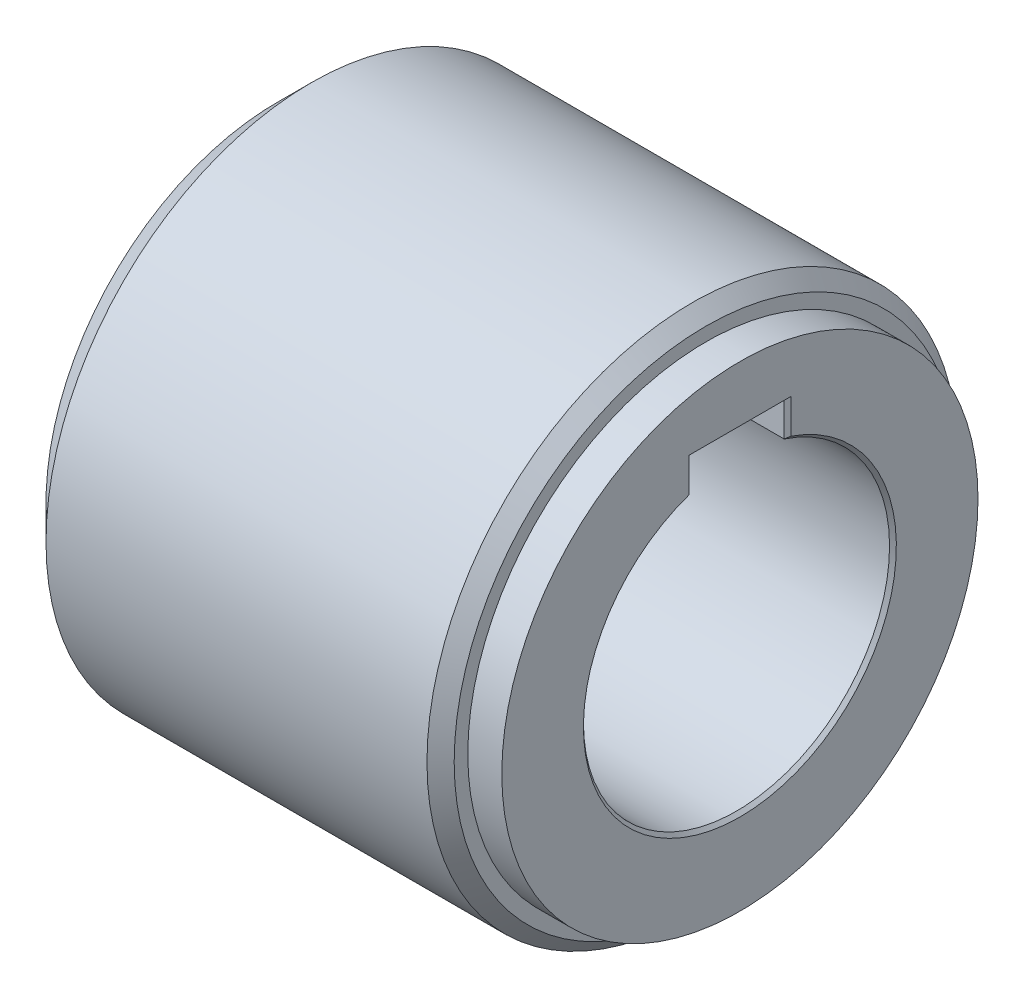
ISO-10303-21;
HEADER;
FILE_DESCRIPTION(('STEP AP214'),'2;1');
FILE_NAME('part.step','',(''),(''),'','','');
FILE_SCHEMA(('AUTOMOTIVE_DESIGN { 1 0 10303 214 1 1 1 1 }'));
ENDSEC;
DATA;
#1=APPLICATION_CONTEXT('core data for automotive mechanical design processes');
#2=APPLICATION_PROTOCOL_DEFINITION('international standard','automotive_design',2000,#1);
#3=PRODUCT_CONTEXT('',#1,'mechanical');
#4=PRODUCT('Part','Part','',(#3));
#5=PRODUCT_RELATED_PRODUCT_CATEGORY('part','',(#4));
#6=PRODUCT_DEFINITION_FORMATION('','',#4);
#7=PRODUCT_DEFINITION_CONTEXT('part definition',#1,'design');
#8=PRODUCT_DEFINITION('design','',#6,#7);
#9=PRODUCT_DEFINITION_SHAPE('','',#8);
#10=(LENGTH_UNIT() NAMED_UNIT(*) SI_UNIT(.MILLI.,.METRE.));
#11=(NAMED_UNIT(*) PLANE_ANGLE_UNIT() SI_UNIT($,.RADIAN.));
#12=(NAMED_UNIT(*) SI_UNIT($,.STERADIAN.) SOLID_ANGLE_UNIT());
#13=UNCERTAINTY_MEASURE_WITH_UNIT(LENGTH_MEASURE(1.E-05),#10,'distance_accuracy_value','');
#14=(GEOMETRIC_REPRESENTATION_CONTEXT(3) GLOBAL_UNCERTAINTY_ASSIGNED_CONTEXT((#13)) GLOBAL_UNIT_ASSIGNED_CONTEXT((#10,
#11,#12)) REPRESENTATION_CONTEXT('',''));
#15=CARTESIAN_POINT('',(0.,0.,0.));
#16=DIRECTION('',(0.,0.,1.));
#17=DIRECTION('',(1.,0.,0.));
#18=AXIS2_PLACEMENT_3D('',#15,#16,#17);
#19=CARTESIAN_POINT('',(34.,0.,0.));
#20=DIRECTION('',(1.,0.,0.));
#21=DIRECTION('',(0.,0.,-1.));
#22=AXIS2_PLACEMENT_3D('',#19,#20,#21);
#23=PLANE('',#22);
#24=DIRECTION('',(0.,0.,-1.));
#25=VECTOR('',#24,1.);
#26=CARTESIAN_POINT('',(34.,26.8,0.));
#27=LINE('',#26,#25);
#28=CARTESIAN_POINT('',(34.,26.8,7.50000000000004));
#29=VERTEX_POINT('',#28);
#30=CARTESIAN_POINT('',(34.,26.8,-7.50000000000003));
#31=VERTEX_POINT('',#30);
#32=EDGE_CURVE('E157',#29,#31,#27,.T.);
#33=ORIENTED_EDGE('',*,*,#32,.T.);
#34=DIRECTION('',(0.,-1.,0.));
#35=VECTOR('',#34,1.);
#36=CARTESIAN_POINT('',(34.,0.,-7.50000000000005));
#37=LINE('',#36,#35);
#38=CARTESIAN_POINT('',(34.,21.7428149051589,-7.50000000000004));
#39=VERTEX_POINT('',#38);
#40=EDGE_CURVE('E159',#31,#39,#37,.T.);
#41=ORIENTED_EDGE('',*,*,#40,.T.);
#42=CARTESIAN_POINT('',(34.,0.,0.));
#43=DIRECTION('',(1.,0.,0.));
#44=DIRECTION('',(0.,0.,-1.));
#45=AXIS2_PLACEMENT_3D('',#42,#43,#44);
#46=CIRCLE('',#45,23.);
#47=CARTESIAN_POINT('',(34.,21.7428149051589,7.50000000000004));
#48=VERTEX_POINT('',#47);
#49=EDGE_CURVE('E139',#39,#48,#46,.F.);
#50=ORIENTED_EDGE('',*,*,#49,.T.);
#51=DIRECTION('',(0.,1.,0.));
#52=VECTOR('',#51,1.);
#53=CARTESIAN_POINT('',(34.,0.,7.50000000000004));
#54=LINE('',#53,#52);
#55=EDGE_CURVE('E150',#48,#29,#54,.T.);
#56=ORIENTED_EDGE('',*,*,#55,.T.);
#57=EDGE_LOOP('',(#33,#41,#50,#56));
#58=FACE_BOUND('',#57,.T.);
#59=CARTESIAN_POINT('',(34.,0.,0.));
#60=DIRECTION('',(-1.,0.,0.));
#61=DIRECTION('',(0.,0.,1.));
#62=AXIS2_PLACEMENT_3D('',#59,#60,#61);
#63=CIRCLE('',#62,35.);
#64=CARTESIAN_POINT('',(34.,0.,35.));
#65=VERTEX_POINT('',#64);
#66=EDGE_CURVE('E226',#65,#65,#63,.T.);
#67=ORIENTED_EDGE('',*,*,#66,.F.);
#68=EDGE_LOOP('',(#67));
#69=FACE_BOUND('',#68,.T.);
#70=ADVANCED_FACE('F43',(#58,#69),#23,.T.);
#71=CARTESIAN_POINT('',(34.,0.,0.));
#72=DIRECTION('',(-1.,0.,0.));
#73=DIRECTION('',(0.,0.,1.));
#74=AXIS2_PLACEMENT_3D('',#71,#72,#73);
#75=CYLINDRICAL_SURFACE('',#74,39.);
#76=CARTESIAN_POINT('',(-29.,0.,0.));
#77=DIRECTION('',(1.,0.,0.));
#78=DIRECTION('',(0.,0.,-1.));
#79=AXIS2_PLACEMENT_3D('',#76,#77,#78);
#80=CIRCLE('',#79,39.);
#81=CARTESIAN_POINT('',(-29.,0.,-39.));
#82=VERTEX_POINT('',#81);
#83=EDGE_CURVE('E133',#82,#82,#80,.T.);
#84=ORIENTED_EDGE('',*,*,#83,.T.);
#85=EDGE_LOOP('',(#84));
#86=FACE_BOUND('',#85,.T.);
#87=CARTESIAN_POINT('',(27.,0.,0.));
#88=DIRECTION('',(-1.,0.,0.));
#89=DIRECTION('',(0.,0.,1.));
#90=AXIS2_PLACEMENT_3D('',#87,#88,#89);
#91=CIRCLE('',#90,39.);
#92=CARTESIAN_POINT('',(27.,0.,39.));
#93=VERTEX_POINT('',#92);
#94=EDGE_CURVE('E285',#93,#93,#91,.T.);
#95=ORIENTED_EDGE('',*,*,#94,.T.);
#96=EDGE_LOOP('',(#95));
#97=FACE_BOUND('',#96,.T.);
#98=ADVANCED_FACE('F279',(#86,#97),#75,.T.);
#99=CARTESIAN_POINT('',(-34.,0.,0.));
#100=DIRECTION('',(1.,0.,0.));
#101=DIRECTION('',(0.,0.,-1.));
#102=AXIS2_PLACEMENT_3D('',#99,#100,#101);
#103=PLANE('',#102);
#104=DIRECTION('',(0.,0.,1.));
#105=VECTOR('',#104,1.);
#106=CARTESIAN_POINT('',(-34.,26.8,7.));
#107=LINE('',#106,#105);
#108=CARTESIAN_POINT('',(-34.,26.8,-7.5));
#109=VERTEX_POINT('',#108);
#110=CARTESIAN_POINT('',(-34.,26.8,7.50000000000001));
#111=VERTEX_POINT('',#110);
#112=EDGE_CURVE('E53',#109,#111,#107,.T.);
#113=ORIENTED_EDGE('',*,*,#112,.T.);
#114=DIRECTION('',(0.,-1.,0.));
#115=VECTOR('',#114,1.);
#116=CARTESIAN_POINT('',(-34.,21.3834047803431,7.50000000000001));
#117=LINE('',#116,#115);
#118=CARTESIAN_POINT('',(-34.,21.7428149051589,7.50000000000001));
#119=VERTEX_POINT('',#118);
#120=EDGE_CURVE('E11',#111,#119,#117,.T.);
#121=ORIENTED_EDGE('',*,*,#120,.T.);
#122=CARTESIAN_POINT('',(-34.,0.,0.));
#123=DIRECTION('',(1.,0.,0.));
#124=DIRECTION('',(0.,0.,-1.));
#125=AXIS2_PLACEMENT_3D('',#122,#123,#124);
#126=CIRCLE('',#125,23.);
#127=CARTESIAN_POINT('',(-34.,21.7428149051589,-7.50000000000001));
#128=VERTEX_POINT('',#127);
#129=EDGE_CURVE('E121',#119,#128,#126,.T.);
#130=ORIENTED_EDGE('',*,*,#129,.T.);
#131=DIRECTION('',(0.,1.,0.));
#132=VECTOR('',#131,1.);
#133=CARTESIAN_POINT('',(-34.,26.3,-7.5));
#134=LINE('',#133,#132);
#135=EDGE_CURVE('E64',#128,#109,#134,.T.);
#136=ORIENTED_EDGE('',*,*,#135,.T.);
#137=EDGE_LOOP('',(#113,#121,#130,#136));
#138=FACE_BOUND('',#137,.T.);
#139=CARTESIAN_POINT('',(-34.,0.,0.));
#140=DIRECTION('',(1.,0.,0.));
#141=DIRECTION('',(0.,0.,-1.));
#142=AXIS2_PLACEMENT_3D('',#139,#140,#141);
#143=CIRCLE('',#142,34.);
#144=CARTESIAN_POINT('',(-34.,0.,-34.));
#145=VERTEX_POINT('',#144);
#146=EDGE_CURVE('E152',#145,#145,#143,.F.);
#147=ORIENTED_EDGE('',*,*,#146,.T.);
#148=EDGE_LOOP('',(#147));
#149=FACE_BOUND('',#148,.T.);
#150=ADVANCED_FACE('F273',(#138,#149),#103,.F.);
#151=CARTESIAN_POINT('',(34.,0.,0.));
#152=DIRECTION('',(-1.,0.,0.));
#153=DIRECTION('',(0.,0.,1.));
#154=AXIS2_PLACEMENT_3D('',#151,#152,#153);
#155=CYLINDRICAL_SURFACE('',#154,22.5);
#156=DIRECTION('',(-1.,0.,0.));
#157=VECTOR('',#156,1.);
#158=CARTESIAN_POINT('',(34.,21.3834047803431,7.));
#159=LINE('',#158,#157);
#160=CARTESIAN_POINT('',(33.5,21.3834047803431,7.));
#161=VERTEX_POINT('',#160);
#162=CARTESIAN_POINT('',(-33.5,21.3834047803431,7.));
#163=VERTEX_POINT('',#162);
#164=EDGE_CURVE('E116',#161,#163,#159,.T.);
#165=ORIENTED_EDGE('',*,*,#164,.F.);
#166=CARTESIAN_POINT('',(33.5,0.,0.));
#167=DIRECTION('',(1.,0.,0.));
#168=DIRECTION('',(0.,0.,-1.));
#169=AXIS2_PLACEMENT_3D('',#166,#167,#168);
#170=CIRCLE('',#169,22.5);
#171=CARTESIAN_POINT('',(33.5,21.3834047803431,-7.));
#172=VERTEX_POINT('',#171);
#173=EDGE_CURVE('E110',#161,#172,#170,.T.);
#174=ORIENTED_EDGE('',*,*,#173,.T.);
#175=DIRECTION('',(-1.,0.,0.));
#176=VECTOR('',#175,1.);
#177=CARTESIAN_POINT('',(34.,21.3834047803431,-7.));
#178=LINE('',#177,#176);
#179=CARTESIAN_POINT('',(-33.5,21.3834047803431,-7.));
#180=VERTEX_POINT('',#179);
#181=EDGE_CURVE('E113',#172,#180,#178,.T.);
#182=ORIENTED_EDGE('',*,*,#181,.T.);
#183=CARTESIAN_POINT('',(-33.5,0.,0.));
#184=DIRECTION('',(1.,0.,0.));
#185=DIRECTION('',(0.,0.,-1.));
#186=AXIS2_PLACEMENT_3D('',#183,#184,#185);
#187=CIRCLE('',#186,22.5);
#188=EDGE_CURVE('E122',#180,#163,#187,.F.);
#189=ORIENTED_EDGE('',*,*,#188,.T.);
#190=EDGE_LOOP('',(#165,#174,#182,#189));
#191=FACE_BOUND('',#190,.T.);
#192=ADVANCED_FACE('F112',(#191),#155,.F.);
#193=CARTESIAN_POINT('',(34.,26.3,-7.));
#194=DIRECTION('',(0.,0.,1.));
#195=DIRECTION('',(0.,-1.,0.));
#196=AXIS2_PLACEMENT_3D('',#193,#194,#195);
#197=PLANE('',#196);
#198=ORIENTED_EDGE('',*,*,#181,.F.);
#199=DIRECTION('',(0.,1.,0.));
#200=VECTOR('',#199,1.);
#201=CARTESIAN_POINT('',(33.5,26.3,-7.));
#202=LINE('',#201,#200);
#203=CARTESIAN_POINT('',(33.5,26.3,-7.));
#204=VERTEX_POINT('',#203);
#205=EDGE_CURVE('E129',#172,#204,#202,.T.);
#206=ORIENTED_EDGE('',*,*,#205,.T.);
#207=DIRECTION('',(-1.,0.,0.));
#208=VECTOR('',#207,1.);
#209=CARTESIAN_POINT('',(34.,26.3,-7.));
#210=LINE('',#209,#208);
#211=CARTESIAN_POINT('',(-33.5,26.3,-7.));
#212=VERTEX_POINT('',#211);
#213=EDGE_CURVE('E134',#204,#212,#210,.T.);
#214=ORIENTED_EDGE('',*,*,#213,.T.);
#215=DIRECTION('',(0.,-1.,0.));
#216=VECTOR('',#215,1.);
#217=CARTESIAN_POINT('',(-33.5,21.3834047803431,-7.));
#218=LINE('',#217,#216);
#219=EDGE_CURVE('E132',#212,#180,#218,.T.);
#220=ORIENTED_EDGE('',*,*,#219,.T.);
#221=EDGE_LOOP('',(#198,#206,#214,#220));
#222=FACE_BOUND('',#221,.T.);
#223=ADVANCED_FACE('F126',(#222),#197,.T.);
#224=CARTESIAN_POINT('',(34.,26.3,7.));
#225=DIRECTION('',(0.,-1.,0.));
#226=DIRECTION('',(0.,0.,-1.));
#227=AXIS2_PLACEMENT_3D('',#224,#225,#226);
#228=PLANE('',#227);
#229=ORIENTED_EDGE('',*,*,#213,.F.);
#230=DIRECTION('',(0.,0.,1.));
#231=VECTOR('',#230,1.);
#232=CARTESIAN_POINT('',(33.5,26.3,7.));
#233=LINE('',#232,#231);
#234=CARTESIAN_POINT('',(33.5,26.3,7.));
#235=VERTEX_POINT('',#234);
#236=EDGE_CURVE('E163',#204,#235,#233,.T.);
#237=ORIENTED_EDGE('',*,*,#236,.T.);
#238=DIRECTION('',(-1.,0.,0.));
#239=VECTOR('',#238,1.);
#240=CARTESIAN_POINT('',(34.,26.3,7.));
#241=LINE('',#240,#239);
#242=CARTESIAN_POINT('',(-33.5,26.3,7.));
#243=VERTEX_POINT('',#242);
#244=EDGE_CURVE('E261',#235,#243,#241,.T.);
#245=ORIENTED_EDGE('',*,*,#244,.T.);
#246=DIRECTION('',(0.,0.,-1.));
#247=VECTOR('',#246,1.);
#248=CARTESIAN_POINT('',(-33.5,26.3,-7.));
#249=LINE('',#248,#247);
#250=EDGE_CURVE('E161',#243,#212,#249,.T.);
#251=ORIENTED_EDGE('',*,*,#250,.T.);
#252=EDGE_LOOP('',(#229,#237,#245,#251));
#253=FACE_BOUND('',#252,.T.);
#254=ADVANCED_FACE('F263',(#253),#228,.T.);
#255=CARTESIAN_POINT('',(34.,26.3,7.));
#256=DIRECTION('',(0.,0.,-1.));
#257=DIRECTION('',(0.,1.,0.));
#258=AXIS2_PLACEMENT_3D('',#255,#256,#257);
#259=PLANE('',#258);
#260=ORIENTED_EDGE('',*,*,#244,.F.);
#261=DIRECTION('',(0.,-1.,0.));
#262=VECTOR('',#261,1.);
#263=CARTESIAN_POINT('',(33.5,26.3,7.));
#264=LINE('',#263,#262);
#265=EDGE_CURVE('E168',#235,#161,#264,.T.);
#266=ORIENTED_EDGE('',*,*,#265,.T.);
#267=ORIENTED_EDGE('',*,*,#164,.T.);
#268=DIRECTION('',(0.,1.,0.));
#269=VECTOR('',#268,1.);
#270=CARTESIAN_POINT('',(-33.5,26.3,7.));
#271=LINE('',#270,#269);
#272=EDGE_CURVE('E165',#163,#243,#271,.T.);
#273=ORIENTED_EDGE('',*,*,#272,.T.);
#274=EDGE_LOOP('',(#260,#266,#267,#273));
#275=FACE_BOUND('',#274,.T.);
#276=ADVANCED_FACE('F260',(#275),#259,.T.);
#277=CARTESIAN_POINT('',(-29.,0.,0.));
#278=DIRECTION('',(1.,0.,0.));
#279=DIRECTION('',(0.,0.,-1.));
#280=AXIS2_PLACEMENT_3D('',#277,#278,#279);
#281=CONICAL_SURFACE('',#280,39.,0.785398163397451);
#282=ORIENTED_EDGE('',*,*,#146,.F.);
#283=EDGE_LOOP('',(#282));
#284=FACE_BOUND('',#283,.T.);
#285=ORIENTED_EDGE('',*,*,#83,.F.);
#286=EDGE_LOOP('',(#285));
#287=FACE_BOUND('',#286,.T.);
#288=ADVANCED_FACE('F207',(#284,#287),#281,.T.);
#289=CARTESIAN_POINT('',(33.5,26.3,7.));
#290=DIRECTION('',(-0.707106781186543,0.,0.707106781186552));
#291=DIRECTION('',(0.,-1.,0.));
#292=AXIS2_PLACEMENT_3D('',#289,#290,#291);
#293=PLANE('',#292);
#294=DIRECTION('',(0.577350269189632,0.577350269189622,0.577350269189624));
#295=VECTOR('',#294,1.);
#296=CARTESIAN_POINT('',(33.5,26.3,7.));
#297=LINE('',#296,#295);
#298=EDGE_CURVE('E143',#29,#235,#297,.F.);
#299=ORIENTED_EDGE('',*,*,#298,.F.);
#300=ORIENTED_EDGE('',*,*,#55,.F.);
#301=CARTESIAN_POINT('',(33.5,21.3834047803431,7.));
#302=CARTESIAN_POINT('',(33.5831907516506,21.443703187152,7.08319075165059));
#303=CARTESIAN_POINT('',(33.6664527954419,21.5038032352174,7.16645279544195));
#304=CARTESIAN_POINT('',(33.8331194621175,21.6236066101313,7.3331194621175));
#305=CARTESIAN_POINT('',(33.9165240849928,21.6833099370045,7.41652408499283));
#306=CARTESIAN_POINT('',(34.,21.7428149051589,7.50000000000004));
#307=B_SPLINE_CURVE_WITH_KNOTS('',3,(#301,#302,#303,#304,#305,#306),.UNSPECIFIED.,.F.,.F.,(4,2,
4),(0.,0.396603536104741,0.793207047515252),.UNSPECIFIED.);
#308=EDGE_CURVE('E213',#161,#48,#307,.T.);
#309=ORIENTED_EDGE('',*,*,#308,.F.);
#310=ORIENTED_EDGE('',*,*,#265,.F.);
#311=EDGE_LOOP('',(#299,#300,#309,#310));
#312=FACE_BOUND('',#311,.T.);
#313=ADVANCED_FACE('F200',(#312),#293,.F.);
#314=CARTESIAN_POINT('',(33.5,0.,0.));
#315=DIRECTION('',(1.,0.,0.));
#316=DIRECTION('',(0.,0.,-1.));
#317=AXIS2_PLACEMENT_3D('',#314,#315,#316);
#318=CONICAL_SURFACE('',#317,22.5,0.785398163397441);
#319=ORIENTED_EDGE('',*,*,#308,.T.);
#320=ORIENTED_EDGE('',*,*,#49,.F.);
#321=CARTESIAN_POINT('',(34.,21.7428149051589,-7.50000000000004));
#322=CARTESIAN_POINT('',(33.9165240849928,21.6833099370045,-7.41652408499283));
#323=CARTESIAN_POINT('',(33.8331194621175,21.6236066101313,-7.3331194621175));
#324=CARTESIAN_POINT('',(33.6664527954419,21.5038032352174,-7.16645279544195));
#325=CARTESIAN_POINT('',(33.5831907516506,21.443703187152,-7.08319075165059));
#326=CARTESIAN_POINT('',(33.5,21.3834047803431,-7.));
#327=B_SPLINE_CURVE_WITH_KNOTS('',3,(#321,#322,#323,#324,#325,#326),.UNSPECIFIED.,.F.,.F.,(4,2,
4),(0.,0.396603511410507,0.793207047515249),.UNSPECIFIED.);
#328=EDGE_CURVE('E137',#172,#39,#327,.F.);
#329=ORIENTED_EDGE('',*,*,#328,.F.);
#330=ORIENTED_EDGE('',*,*,#173,.F.);
#331=EDGE_LOOP('',(#319,#320,#329,#330));
#332=FACE_BOUND('',#331,.T.);
#333=ADVANCED_FACE('F138',(#332),#318,.F.);
#334=CARTESIAN_POINT('',(33.5,26.3,7.));
#335=DIRECTION('',(-0.707106781186541,0.707106781186554,0.));
#336=DIRECTION('',(0.,0.,1.));
#337=AXIS2_PLACEMENT_3D('',#334,#335,#336);
#338=PLANE('',#337);
#339=ORIENTED_EDGE('',*,*,#298,.T.);
#340=ORIENTED_EDGE('',*,*,#236,.F.);
#341=DIRECTION('',(0.577350269189632,0.577350269189622,-0.577350269189623));
#342=VECTOR('',#341,1.);
#343=CARTESIAN_POINT('',(33.5,26.3,-7.));
#344=LINE('',#343,#342);
#345=EDGE_CURVE('E144',#31,#204,#344,.F.);
#346=ORIENTED_EDGE('',*,*,#345,.F.);
#347=ORIENTED_EDGE('',*,*,#32,.F.);
#348=EDGE_LOOP('',(#339,#340,#346,#347));
#349=FACE_BOUND('',#348,.T.);
#350=ADVANCED_FACE('F193',(#349),#338,.F.);
#351=CARTESIAN_POINT('',(33.5,26.3,-7.));
#352=DIRECTION('',(-0.707106781186542,0.,-0.707106781186553));
#353=DIRECTION('',(0.,1.,0.));
#354=AXIS2_PLACEMENT_3D('',#351,#352,#353);
#355=PLANE('',#354);
#356=ORIENTED_EDGE('',*,*,#328,.T.);
#357=ORIENTED_EDGE('',*,*,#40,.F.);
#358=ORIENTED_EDGE('',*,*,#345,.T.);
#359=ORIENTED_EDGE('',*,*,#205,.F.);
#360=EDGE_LOOP('',(#356,#357,#358,#359));
#361=FACE_BOUND('',#360,.T.);
#362=ADVANCED_FACE('F146',(#361),#355,.F.);
#363=CARTESIAN_POINT('',(-34.,0.,-7.50000000000002));
#364=DIRECTION('',(-0.707106781186549,0.,0.707106781186546));
#365=DIRECTION('',(0.,-1.,0.));
#366=AXIS2_PLACEMENT_3D('',#363,#364,#365);
#367=PLANE('',#366);
#368=CARTESIAN_POINT('',(-33.5,21.3834047803431,-7.));
#369=CARTESIAN_POINT('',(-33.5831907516506,21.443703187152,-7.08319075165059));
#370=CARTESIAN_POINT('',(-33.6664527954419,21.5038032352174,-7.16645279544194));
#371=CARTESIAN_POINT('',(-33.8331194621175,21.6236066101313,-7.33311946211748));
#372=CARTESIAN_POINT('',(-33.9165240849928,21.6833099370045,-7.4165240849928));
#373=CARTESIAN_POINT('',(-34.,21.7428149051589,-7.50000000000001));
#374=B_SPLINE_CURVE_WITH_KNOTS('',3,(#368,#369,#370,#371,#372,#373),.UNSPECIFIED.,.F.,.F.,(4,2,
4),(0.,0.39660353610471,0.793207047515189),.UNSPECIFIED.);
#375=EDGE_CURVE('E241',#180,#128,#374,.T.);
#376=ORIENTED_EDGE('',*,*,#375,.F.);
#377=ORIENTED_EDGE('',*,*,#219,.F.);
#378=DIRECTION('',(-0.577350269189623,0.577350269189629,-0.577350269189626));
#379=VECTOR('',#378,1.);
#380=CARTESIAN_POINT('',(-31.5,24.3,-5.));
#381=LINE('',#380,#379);
#382=EDGE_CURVE('E48',#109,#212,#381,.F.);
#383=ORIENTED_EDGE('',*,*,#382,.F.);
#384=ORIENTED_EDGE('',*,*,#135,.F.);
#385=EDGE_LOOP('',(#376,#377,#383,#384));
#386=FACE_BOUND('',#385,.T.);
#387=ADVANCED_FACE('F192',(#386),#367,.T.);
#388=CARTESIAN_POINT('',(-34.,26.8,0.));
#389=DIRECTION('',(-0.707106781186551,-0.707106781186544,0.));
#390=DIRECTION('',(0.,0.,-1.));
#391=AXIS2_PLACEMENT_3D('',#388,#389,#390);
#392=PLANE('',#391);
#393=ORIENTED_EDGE('',*,*,#382,.T.);
#394=ORIENTED_EDGE('',*,*,#250,.F.);
#395=DIRECTION('',(-0.577350269189622,0.577350269189628,0.577350269189627));
#396=VECTOR('',#395,1.);
#397=CARTESIAN_POINT('',(-25.0666666666667,17.8666666666666,-1.43333333333338));
#398=LINE('',#397,#396);
#399=EDGE_CURVE('E225',#111,#243,#398,.F.);
#400=ORIENTED_EDGE('',*,*,#399,.F.);
#401=ORIENTED_EDGE('',*,*,#112,.F.);
#402=EDGE_LOOP('',(#393,#394,#400,#401));
#403=FACE_BOUND('',#402,.T.);
#404=ADVANCED_FACE('F46',(#403),#392,.T.);
#405=CARTESIAN_POINT('',(-34.,0.,0.));
#406=DIRECTION('',(-1.,0.,0.));
#407=DIRECTION('',(0.,0.,1.));
#408=AXIS2_PLACEMENT_3D('',#405,#406,#407);
#409=CONICAL_SURFACE('',#408,23.,0.785398163397452);
#410=ORIENTED_EDGE('',*,*,#375,.T.);
#411=ORIENTED_EDGE('',*,*,#129,.F.);
#412=CARTESIAN_POINT('',(-34.,21.7428149051589,7.50000000000001));
#413=CARTESIAN_POINT('',(-33.9165240849928,21.6833099370045,7.4165240849928));
#414=CARTESIAN_POINT('',(-33.8331194621175,21.6236066101313,7.33311946211748));
#415=CARTESIAN_POINT('',(-33.6664527954419,21.5038032352174,7.16645279544194));
#416=CARTESIAN_POINT('',(-33.5831907516506,21.443703187152,7.08319075165059));
#417=CARTESIAN_POINT('',(-33.5,21.3834047803431,7.));
#418=B_SPLINE_CURVE_WITH_KNOTS('',3,(#412,#413,#414,#415,#416,#417),.UNSPECIFIED.,.F.,.F.,(4,2,
4),(0.,0.396603511410481,0.793207047515194),.UNSPECIFIED.);
#419=EDGE_CURVE('E219',#163,#119,#418,.F.);
#420=ORIENTED_EDGE('',*,*,#419,.F.);
#421=ORIENTED_EDGE('',*,*,#188,.F.);
#422=EDGE_LOOP('',(#410,#411,#420,#421));
#423=FACE_BOUND('',#422,.T.);
#424=ADVANCED_FACE('F210',(#423),#409,.F.);
#425=CARTESIAN_POINT('',(-34.,0.,7.50000000000001));
#426=DIRECTION('',(-0.70710678118655,0.,-0.707106781186545));
#427=DIRECTION('',(0.,1.,0.));
#428=AXIS2_PLACEMENT_3D('',#425,#426,#427);
#429=PLANE('',#428);
#430=ORIENTED_EDGE('',*,*,#399,.T.);
#431=ORIENTED_EDGE('',*,*,#272,.F.);
#432=ORIENTED_EDGE('',*,*,#419,.T.);
#433=ORIENTED_EDGE('',*,*,#120,.F.);
#434=EDGE_LOOP('',(#430,#431,#432,#433));
#435=FACE_BOUND('',#434,.T.);
#436=ADVANCED_FACE('F228',(#435),#429,.T.);
#437=CARTESIAN_POINT('',(0.,0.,0.));
#438=DIRECTION('',(-1.,0.,0.));
#439=DIRECTION('',(0.,0.,1.));
#440=AXIS2_PLACEMENT_3D('',#437,#438,#439);
#441=CYLINDRICAL_SURFACE('',#440,35.);
#442=ORIENTED_EDGE('',*,*,#66,.T.);
#443=EDGE_LOOP('',(#442));
#444=FACE_BOUND('',#443,.T.);
#445=CARTESIAN_POINT('',(29.,0.,0.));
#446=DIRECTION('',(-1.,0.,0.));
#447=DIRECTION('',(0.,0.,1.));
#448=AXIS2_PLACEMENT_3D('',#445,#446,#447);
#449=CIRCLE('',#448,35.);
#450=CARTESIAN_POINT('',(29.,0.,35.));
#451=VERTEX_POINT('',#450);
#452=EDGE_CURVE('E290',#451,#451,#449,.T.);
#453=ORIENTED_EDGE('',*,*,#452,.F.);
#454=EDGE_LOOP('',(#453));
#455=FACE_BOUND('',#454,.T.);
#456=ADVANCED_FACE('F234',(#444,#455),#441,.T.);
#457=CARTESIAN_POINT('',(29.,35.,0.));
#458=DIRECTION('',(1.,0.,0.));
#459=DIRECTION('',(0.,0.,-1.));
#460=AXIS2_PLACEMENT_3D('',#457,#458,#459);
#461=PLANE('',#460);
#462=ORIENTED_EDGE('',*,*,#452,.T.);
#463=EDGE_LOOP('',(#462));
#464=FACE_BOUND('',#463,.T.);
#465=CARTESIAN_POINT('',(29.,0.,0.));
#466=DIRECTION('',(-1.,0.,0.));
#467=DIRECTION('',(0.,0.,1.));
#468=AXIS2_PLACEMENT_3D('',#465,#466,#467);
#469=CIRCLE('',#468,37.);
#470=CARTESIAN_POINT('',(29.,0.,37.));
#471=VERTEX_POINT('',#470);
#472=EDGE_CURVE('E287',#471,#471,#469,.T.);
#473=ORIENTED_EDGE('',*,*,#472,.F.);
#474=EDGE_LOOP('',(#473));
#475=FACE_BOUND('',#474,.T.);
#476=ADVANCED_FACE('F325',(#464,#475),#461,.T.);
#477=CARTESIAN_POINT('',(27.,0.,0.));
#478=DIRECTION('',(-1.,0.,0.));
#479=DIRECTION('',(0.,0.,1.));
#480=AXIS2_PLACEMENT_3D('',#477,#478,#479);
#481=CONICAL_SURFACE('',#480,39.,0.785398163397443);
#482=ORIENTED_EDGE('',*,*,#472,.T.);
#483=EDGE_LOOP('',(#482));
#484=FACE_BOUND('',#483,.T.);
#485=ORIENTED_EDGE('',*,*,#94,.F.);
#486=EDGE_LOOP('',(#485));
#487=FACE_BOUND('',#486,.T.);
#488=ADVANCED_FACE('F328',(#484,#487),#481,.T.);
#489=CLOSED_SHELL('',(#70,#98,#150,#192,#223,#254,#276,#288,#313,#333,#350,#362,#387,#404,#424,
#436,#456,#476,#488));
#490=MANIFOLD_SOLID_BREP('B2',#489);
#491=ADVANCED_BREP_SHAPE_REPRESENTATION('',(#18,#490),#14);
#492=SHAPE_DEFINITION_REPRESENTATION(#9,#491);
ENDSEC;
END-ISO-10303-21;
